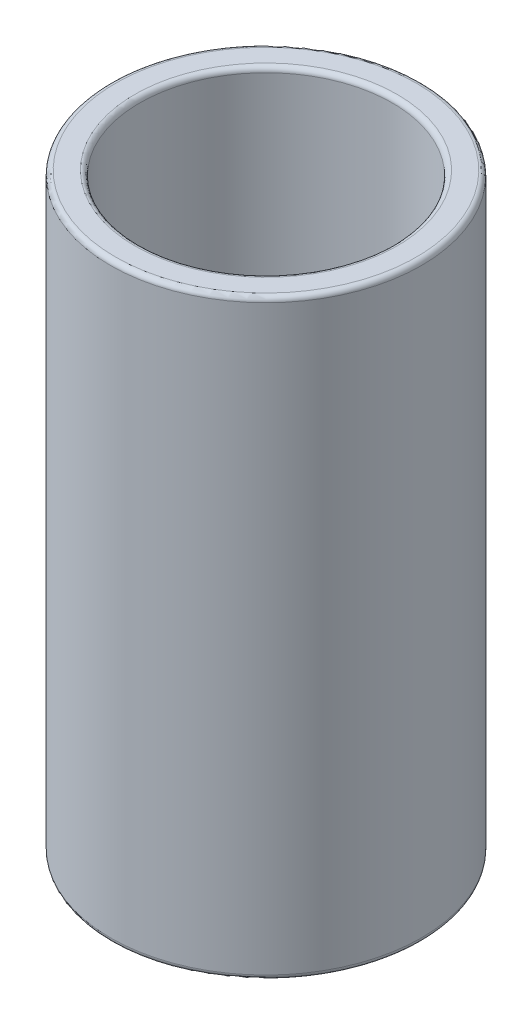
ISO-10303-21;
HEADER;
FILE_DESCRIPTION(('STEP AP214'),'2;1');
FILE_NAME('part.step','',(''),(''),'','','');
FILE_SCHEMA(('AUTOMOTIVE_DESIGN { 1 0 10303 214 1 1 1 1 }'));
ENDSEC;
DATA;
#1=APPLICATION_CONTEXT('core data for automotive mechanical design processes');
#2=APPLICATION_PROTOCOL_DEFINITION('international standard','automotive_design',2000,#1);
#3=PRODUCT_CONTEXT('',#1,'mechanical');
#4=PRODUCT('Part','Part','',(#3));
#5=PRODUCT_RELATED_PRODUCT_CATEGORY('part','',(#4));
#6=PRODUCT_DEFINITION_FORMATION('','',#4);
#7=PRODUCT_DEFINITION_CONTEXT('part definition',#1,'design');
#8=PRODUCT_DEFINITION('design','',#6,#7);
#9=PRODUCT_DEFINITION_SHAPE('','',#8);
#10=(LENGTH_UNIT() NAMED_UNIT(*) SI_UNIT(.MILLI.,.METRE.));
#11=(NAMED_UNIT(*) PLANE_ANGLE_UNIT() SI_UNIT($,.RADIAN.));
#12=(NAMED_UNIT(*) SI_UNIT($,.STERADIAN.) SOLID_ANGLE_UNIT());
#13=UNCERTAINTY_MEASURE_WITH_UNIT(LENGTH_MEASURE(1.E-05),#10,'distance_accuracy_value','');
#14=(GEOMETRIC_REPRESENTATION_CONTEXT(3) GLOBAL_UNCERTAINTY_ASSIGNED_CONTEXT((#13)) GLOBAL_UNIT_ASSIGNED_CONTEXT((#10,
#11,#12)) REPRESENTATION_CONTEXT('',''));
#15=CARTESIAN_POINT('',(0.,0.,0.));
#16=DIRECTION('',(0.,0.,1.));
#17=DIRECTION('',(1.,0.,0.));
#18=AXIS2_PLACEMENT_3D('',#15,#16,#17);
#19=CARTESIAN_POINT('',(0.,120.,0.));
#20=DIRECTION('',(0.,1.,0.));
#21=DIRECTION('',(0.,0.,1.));
#22=AXIS2_PLACEMENT_3D('',#19,#20,#21);
#23=PLANE('',#22);
#24=CARTESIAN_POINT('',(0.,120.,0.));
#25=DIRECTION('',(0.,1.,0.));
#26=DIRECTION('',(0.,0.,1.));
#27=AXIS2_PLACEMENT_3D('',#24,#25,#26);
#28=CIRCLE('',#27,30.5);
#29=CARTESIAN_POINT('',(0.,120.,30.5));
#30=VERTEX_POINT('',#29);
#31=EDGE_CURVE('E10',#30,#30,#28,.T.);
#32=ORIENTED_EDGE('',*,*,#31,.T.);
#33=EDGE_LOOP('',(#32));
#34=FACE_BOUND('',#33,.T.);
#35=CARTESIAN_POINT('',(0.,120.,0.));
#36=DIRECTION('',(0.,1.,0.));
#37=DIRECTION('',(0.,0.,1.));
#38=AXIS2_PLACEMENT_3D('',#35,#36,#37);
#39=CIRCLE('',#38,26.6);
#40=CARTESIAN_POINT('',(0.,120.,26.6));
#41=VERTEX_POINT('',#40);
#42=EDGE_CURVE('E38',#41,#41,#39,.F.);
#43=ORIENTED_EDGE('',*,*,#42,.T.);
#44=EDGE_LOOP('',(#43));
#45=FACE_BOUND('',#44,.T.);
#46=ADVANCED_FACE('F31',(#34,#45),#23,.T.);
#47=CARTESIAN_POINT('',(0.,0.,0.));
#48=DIRECTION('',(0.,1.,0.));
#49=DIRECTION('',(0.,0.,1.));
#50=AXIS2_PLACEMENT_3D('',#47,#48,#49);
#51=PLANE('',#50);
#52=CARTESIAN_POINT('',(0.,0.,0.));
#53=DIRECTION('',(0.,1.,0.));
#54=DIRECTION('',(0.,0.,1.));
#55=AXIS2_PLACEMENT_3D('',#52,#53,#54);
#56=CIRCLE('',#55,26.6);
#57=CARTESIAN_POINT('',(0.,0.,26.6));
#58=VERTEX_POINT('',#57);
#59=EDGE_CURVE('E57',#58,#58,#56,.T.);
#60=ORIENTED_EDGE('',*,*,#59,.T.);
#61=EDGE_LOOP('',(#60));
#62=FACE_BOUND('',#61,.T.);
#63=CARTESIAN_POINT('',(0.,0.,0.));
#64=DIRECTION('',(0.,1.,0.));
#65=DIRECTION('',(0.,0.,1.));
#66=AXIS2_PLACEMENT_3D('',#63,#64,#65);
#67=CIRCLE('',#66,30.5);
#68=CARTESIAN_POINT('',(0.,0.,30.5));
#69=VERTEX_POINT('',#68);
#70=EDGE_CURVE('E60',#69,#69,#67,.F.);
#71=ORIENTED_EDGE('',*,*,#70,.T.);
#72=EDGE_LOOP('',(#71));
#73=FACE_BOUND('',#72,.T.);
#74=ADVANCED_FACE('F64',(#62,#73),#51,.F.);
#75=CARTESIAN_POINT('',(0.,120.,0.));
#76=DIRECTION('',(0.,-1.,0.));
#77=DIRECTION('',(0.,0.,-1.));
#78=AXIS2_PLACEMENT_3D('',#75,#76,#77);
#79=CYLINDRICAL_SURFACE('',#78,31.5);
#80=CARTESIAN_POINT('',(0.,1.,0.));
#81=DIRECTION('',(0.,1.,0.));
#82=DIRECTION('',(0.,0.,1.));
#83=AXIS2_PLACEMENT_3D('',#80,#81,#82);
#84=CIRCLE('',#83,31.5);
#85=CARTESIAN_POINT('',(0.,1.,31.5));
#86=VERTEX_POINT('',#85);
#87=EDGE_CURVE('E42',#86,#86,#84,.T.);
#88=ORIENTED_EDGE('',*,*,#87,.T.);
#89=EDGE_LOOP('',(#88));
#90=FACE_BOUND('',#89,.T.);
#91=CARTESIAN_POINT('',(0.,119.,0.));
#92=DIRECTION('',(0.,1.,0.));
#93=DIRECTION('',(0.,0.,1.));
#94=AXIS2_PLACEMENT_3D('',#91,#92,#93);
#95=CIRCLE('',#94,31.5);
#96=CARTESIAN_POINT('',(0.,119.,31.5));
#97=VERTEX_POINT('',#96);
#98=EDGE_CURVE('E46',#97,#97,#95,.F.);
#99=ORIENTED_EDGE('',*,*,#98,.T.);
#100=EDGE_LOOP('',(#99));
#101=FACE_BOUND('',#100,.T.);
#102=ADVANCED_FACE('F74',(#90,#101),#79,.T.);
#103=CARTESIAN_POINT('',(0.,120.,0.));
#104=DIRECTION('',(0.,-1.,0.));
#105=DIRECTION('',(0.,0.,-1.));
#106=AXIS2_PLACEMENT_3D('',#103,#104,#105);
#107=CYLINDRICAL_SURFACE('',#106,25.6);
#108=CARTESIAN_POINT('',(0.,1.,0.));
#109=DIRECTION('',(0.,1.,0.));
#110=DIRECTION('',(0.,0.,1.));
#111=AXIS2_PLACEMENT_3D('',#108,#109,#110);
#112=CIRCLE('',#111,25.6);
#113=CARTESIAN_POINT('',(0.,1.,25.6));
#114=VERTEX_POINT('',#113);
#115=EDGE_CURVE('E51',#114,#114,#112,.F.);
#116=ORIENTED_EDGE('',*,*,#115,.T.);
#117=EDGE_LOOP('',(#116));
#118=FACE_BOUND('',#117,.T.);
#119=CARTESIAN_POINT('',(0.,119.,0.));
#120=DIRECTION('',(0.,1.,0.));
#121=DIRECTION('',(0.,0.,1.));
#122=AXIS2_PLACEMENT_3D('',#119,#120,#121);
#123=CIRCLE('',#122,25.6);
#124=CARTESIAN_POINT('',(0.,119.,25.6));
#125=VERTEX_POINT('',#124);
#126=EDGE_CURVE('E54',#125,#125,#123,.T.);
#127=ORIENTED_EDGE('',*,*,#126,.T.);
#128=EDGE_LOOP('',(#127));
#129=FACE_BOUND('',#128,.T.);
#130=ADVANCED_FACE('F77',(#118,#129),#107,.F.);
#131=CARTESIAN_POINT('',(0.,1.,0.));
#132=DIRECTION('',(0.,1.,0.));
#133=DIRECTION('',(0.,0.,1.));
#134=AXIS2_PLACEMENT_3D('',#131,#132,#133);
#135=TOROIDAL_SURFACE('',#134,26.6,1.);
#136=ORIENTED_EDGE('',*,*,#115,.F.);
#137=EDGE_LOOP('',(#136));
#138=FACE_BOUND('',#137,.T.);
#139=ORIENTED_EDGE('',*,*,#59,.F.);
#140=EDGE_LOOP('',(#139));
#141=FACE_BOUND('',#140,.T.);
#142=ADVANCED_FACE('F70',(#138,#141),#135,.T.);
#143=CARTESIAN_POINT('',(0.,1.,0.));
#144=DIRECTION('',(0.,1.,0.));
#145=DIRECTION('',(0.,0.,1.));
#146=AXIS2_PLACEMENT_3D('',#143,#144,#145);
#147=TOROIDAL_SURFACE('',#146,30.5,1.);
#148=ORIENTED_EDGE('',*,*,#70,.F.);
#149=EDGE_LOOP('',(#148));
#150=FACE_BOUND('',#149,.T.);
#151=ORIENTED_EDGE('',*,*,#87,.F.);
#152=EDGE_LOOP('',(#151));
#153=FACE_BOUND('',#152,.T.);
#154=ADVANCED_FACE('F66',(#150,#153),#147,.T.);
#155=CARTESIAN_POINT('',(0.,119.,0.));
#156=DIRECTION('',(0.,1.,0.));
#157=DIRECTION('',(0.,0.,1.));
#158=AXIS2_PLACEMENT_3D('',#155,#156,#157);
#159=TOROIDAL_SURFACE('',#158,30.5,1.);
#160=ORIENTED_EDGE('',*,*,#98,.F.);
#161=EDGE_LOOP('',(#160));
#162=FACE_BOUND('',#161,.T.);
#163=ORIENTED_EDGE('',*,*,#31,.F.);
#164=EDGE_LOOP('',(#163));
#165=FACE_BOUND('',#164,.T.);
#166=ADVANCED_FACE('F69',(#162,#165),#159,.T.);
#167=CARTESIAN_POINT('',(0.,119.,0.));
#168=DIRECTION('',(0.,1.,0.));
#169=DIRECTION('',(0.,0.,1.));
#170=AXIS2_PLACEMENT_3D('',#167,#168,#169);
#171=TOROIDAL_SURFACE('',#170,26.6,1.);
#172=ORIENTED_EDGE('',*,*,#42,.F.);
#173=EDGE_LOOP('',(#172));
#174=FACE_BOUND('',#173,.T.);
#175=ORIENTED_EDGE('',*,*,#126,.F.);
#176=EDGE_LOOP('',(#175));
#177=FACE_BOUND('',#176,.T.);
#178=ADVANCED_FACE('F33',(#174,#177),#171,.T.);
#179=CLOSED_SHELL('',(#46,#74,#102,#130,#142,#154,#166,#178));
#180=MANIFOLD_SOLID_BREP('B2',#179);
#181=ADVANCED_BREP_SHAPE_REPRESENTATION('',(#18,#180),#14);
#182=SHAPE_DEFINITION_REPRESENTATION(#9,#181);
ENDSEC;
END-ISO-10303-21;
